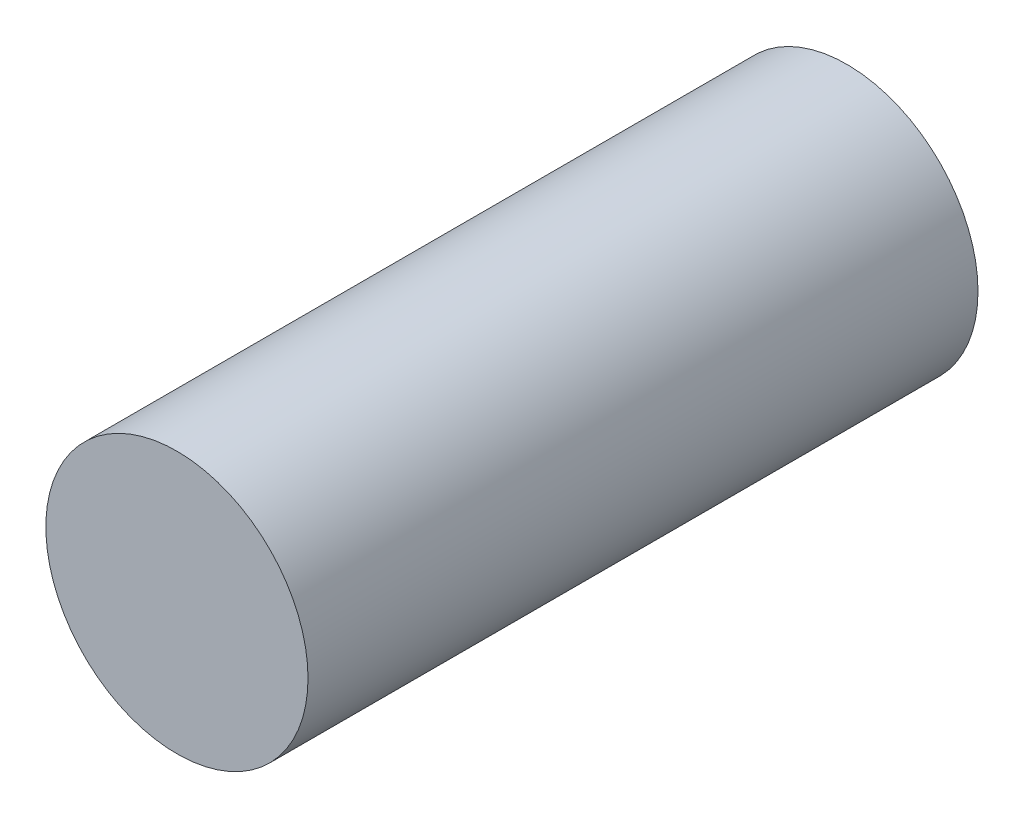
ISO-10303-21;
HEADER;
FILE_DESCRIPTION(('STEP AP214'),'2;1');
FILE_NAME('part.step','',(''),(''),'','','');
FILE_SCHEMA(('AUTOMOTIVE_DESIGN { 1 0 10303 214 1 1 1 1 }'));
ENDSEC;
DATA;
#1=APPLICATION_CONTEXT('core data for automotive mechanical design processes');
#2=APPLICATION_PROTOCOL_DEFINITION('international standard','automotive_design',2000,#1);
#3=PRODUCT_CONTEXT('',#1,'mechanical');
#4=PRODUCT('Part','Part','',(#3));
#5=PRODUCT_RELATED_PRODUCT_CATEGORY('part','',(#4));
#6=PRODUCT_DEFINITION_FORMATION('','',#4);
#7=PRODUCT_DEFINITION_CONTEXT('part definition',#1,'design');
#8=PRODUCT_DEFINITION('design','',#6,#7);
#9=PRODUCT_DEFINITION_SHAPE('','',#8);
#10=(LENGTH_UNIT() NAMED_UNIT(*) SI_UNIT(.MILLI.,.METRE.));
#11=(NAMED_UNIT(*) PLANE_ANGLE_UNIT() SI_UNIT($,.RADIAN.));
#12=(NAMED_UNIT(*) SI_UNIT($,.STERADIAN.) SOLID_ANGLE_UNIT());
#13=UNCERTAINTY_MEASURE_WITH_UNIT(LENGTH_MEASURE(1.E-05),#10,'distance_accuracy_value','');
#14=(GEOMETRIC_REPRESENTATION_CONTEXT(3) GLOBAL_UNCERTAINTY_ASSIGNED_CONTEXT((#13)) GLOBAL_UNIT_ASSIGNED_CONTEXT((#10,
#11,#12)) REPRESENTATION_CONTEXT('',''));
#15=CARTESIAN_POINT('',(0.,0.,0.));
#16=DIRECTION('',(0.,0.,1.));
#17=DIRECTION('',(1.,0.,0.));
#18=AXIS2_PLACEMENT_3D('',#15,#16,#17);
#19=CARTESIAN_POINT('',(0.,0.,23.));
#20=DIRECTION('',(0.,0.,-1.));
#21=DIRECTION('',(-1.,0.,0.));
#22=AXIS2_PLACEMENT_3D('',#19,#20,#21);
#23=CYLINDRICAL_SURFACE('',#22,4.5);
#24=CARTESIAN_POINT('',(0.,0.,23.));
#25=DIRECTION('',(0.,0.,1.));
#26=DIRECTION('',(1.,0.,0.));
#27=AXIS2_PLACEMENT_3D('',#24,#25,#26);
#28=CIRCLE('',#27,4.5);
#29=CARTESIAN_POINT('',(4.5,0.,23.));
#30=VERTEX_POINT('',#29);
#31=EDGE_CURVE('E10',#30,#30,#28,.T.);
#32=ORIENTED_EDGE('',*,*,#31,.F.);
#33=EDGE_LOOP('',(#32));
#34=FACE_BOUND('',#33,.T.);
#35=CARTESIAN_POINT('',(0.,0.,0.));
#36=DIRECTION('',(0.,0.,1.));
#37=DIRECTION('',(1.,0.,0.));
#38=AXIS2_PLACEMENT_3D('',#35,#36,#37);
#39=CIRCLE('',#38,4.5);
#40=CARTESIAN_POINT('',(4.5,0.,0.));
#41=VERTEX_POINT('',#40);
#42=EDGE_CURVE('E42',#41,#41,#39,.T.);
#43=ORIENTED_EDGE('',*,*,#42,.T.);
#44=EDGE_LOOP('',(#43));
#45=FACE_BOUND('',#44,.T.);
#46=ADVANCED_FACE('F39',(#34,#45),#23,.T.);
#47=CARTESIAN_POINT('',(0.,0.,23.));
#48=DIRECTION('',(0.,0.,1.));
#49=DIRECTION('',(1.,0.,0.));
#50=AXIS2_PLACEMENT_3D('',#47,#48,#49);
#51=PLANE('',#50);
#52=ORIENTED_EDGE('',*,*,#31,.T.);
#53=EDGE_LOOP('',(#52));
#54=FACE_BOUND('',#53,.T.);
#55=ADVANCED_FACE('F54',(#54),#51,.T.);
#56=CARTESIAN_POINT('',(0.,0.,0.));
#57=DIRECTION('',(0.,0.,1.));
#58=DIRECTION('',(1.,0.,0.));
#59=AXIS2_PLACEMENT_3D('',#56,#57,#58);
#60=PLANE('',#59);
#61=ORIENTED_EDGE('',*,*,#42,.F.);
#62=EDGE_LOOP('',(#61));
#63=FACE_BOUND('',#62,.T.);
#64=ADVANCED_FACE('F52',(#63),#60,.F.);
#65=CLOSED_SHELL('',(#46,#55,#64));
#66=MANIFOLD_SOLID_BREP('B2',#65);
#67=ADVANCED_BREP_SHAPE_REPRESENTATION('',(#18,#66),#14);
#68=SHAPE_DEFINITION_REPRESENTATION(#9,#67);
ENDSEC;
END-ISO-10303-21;
